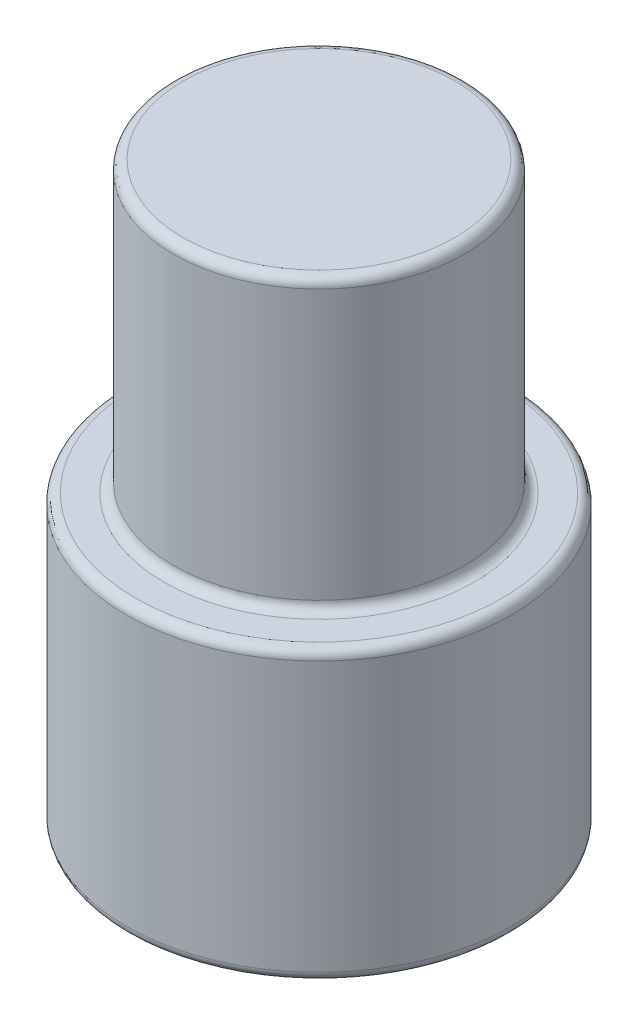
ISO-10303-21;
HEADER;
FILE_DESCRIPTION(('STEP AP214'),'2;1');
FILE_NAME('part.step','',(''),(''),'','','');
FILE_SCHEMA(('AUTOMOTIVE_DESIGN { 1 0 10303 214 1 1 1 1 }'));
ENDSEC;
DATA;
#1=APPLICATION_CONTEXT('core data for automotive mechanical design processes');
#2=APPLICATION_PROTOCOL_DEFINITION('international standard','automotive_design',2000,#1);
#3=PRODUCT_CONTEXT('',#1,'mechanical');
#4=PRODUCT('Part','Part','',(#3));
#5=PRODUCT_RELATED_PRODUCT_CATEGORY('part','',(#4));
#6=PRODUCT_DEFINITION_FORMATION('','',#4);
#7=PRODUCT_DEFINITION_CONTEXT('part definition',#1,'design');
#8=PRODUCT_DEFINITION('design','',#6,#7);
#9=PRODUCT_DEFINITION_SHAPE('','',#8);
#10=(LENGTH_UNIT() NAMED_UNIT(*) SI_UNIT(.MILLI.,.METRE.));
#11=(NAMED_UNIT(*) PLANE_ANGLE_UNIT() SI_UNIT($,.RADIAN.));
#12=(NAMED_UNIT(*) SI_UNIT($,.STERADIAN.) SOLID_ANGLE_UNIT());
#13=UNCERTAINTY_MEASURE_WITH_UNIT(LENGTH_MEASURE(1.E-05),#10,'distance_accuracy_value','');
#14=(GEOMETRIC_REPRESENTATION_CONTEXT(3) GLOBAL_UNCERTAINTY_ASSIGNED_CONTEXT((#13)) GLOBAL_UNIT_ASSIGNED_CONTEXT((#10,
#11,#12)) REPRESENTATION_CONTEXT('',''));
#15=CARTESIAN_POINT('',(0.,0.,0.));
#16=DIRECTION('',(0.,0.,1.));
#17=DIRECTION('',(1.,0.,0.));
#18=AXIS2_PLACEMENT_3D('',#15,#16,#17);
#19=CARTESIAN_POINT('',(0.,15.,0.));
#20=DIRECTION('',(0.,-1.,0.));
#21=DIRECTION('',(0.,0.,-1.));
#22=AXIS2_PLACEMENT_3D('',#19,#20,#21);
#23=CYLINDRICAL_SURFACE('',#22,10.);
#24=CARTESIAN_POINT('',(0.,0.5,0.));
#25=DIRECTION('',(0.,1.,0.));
#26=DIRECTION('',(0.,0.,1.));
#27=AXIS2_PLACEMENT_3D('',#24,#25,#26);
#28=CIRCLE('',#27,10.);
#29=CARTESIAN_POINT('',(0.,0.5,10.));
#30=VERTEX_POINT('',#29);
#31=EDGE_CURVE('E69',#30,#30,#28,.T.);
#32=ORIENTED_EDGE('',*,*,#31,.T.);
#33=EDGE_LOOP('',(#32));
#34=FACE_BOUND('',#33,.T.);
#35=CARTESIAN_POINT('',(0.,14.5,0.));
#36=DIRECTION('',(0.,1.,0.));
#37=DIRECTION('',(0.,0.,1.));
#38=AXIS2_PLACEMENT_3D('',#35,#36,#37);
#39=CIRCLE('',#38,10.);
#40=CARTESIAN_POINT('',(0.,14.5,10.));
#41=VERTEX_POINT('',#40);
#42=EDGE_CURVE('E73',#41,#41,#39,.F.);
#43=ORIENTED_EDGE('',*,*,#42,.T.);
#44=EDGE_LOOP('',(#43));
#45=FACE_BOUND('',#44,.T.);
#46=ADVANCED_FACE('F37',(#34,#45),#23,.T.);
#47=CARTESIAN_POINT('',(0.,15.,0.));
#48=DIRECTION('',(0.,1.,0.));
#49=DIRECTION('',(0.,0.,1.));
#50=AXIS2_PLACEMENT_3D('',#47,#48,#49);
#51=PLANE('',#50);
#52=CARTESIAN_POINT('',(0.,15.,0.));
#53=DIRECTION('',(0.,1.,0.));
#54=DIRECTION('',(0.,0.,1.));
#55=AXIS2_PLACEMENT_3D('',#52,#53,#54);
#56=CIRCLE('',#55,9.5);
#57=CARTESIAN_POINT('',(0.,15.,9.5));
#58=VERTEX_POINT('',#57);
#59=EDGE_CURVE('E55',#58,#58,#56,.T.);
#60=ORIENTED_EDGE('',*,*,#59,.T.);
#61=EDGE_LOOP('',(#60));
#62=FACE_BOUND('',#61,.T.);
#63=CARTESIAN_POINT('',(0.,15.,0.));
#64=DIRECTION('',(0.,1.,0.));
#65=DIRECTION('',(0.,0.,1.));
#66=AXIS2_PLACEMENT_3D('',#63,#64,#65);
#67=CIRCLE('',#66,8.05);
#68=CARTESIAN_POINT('',(0.,15.,8.05));
#69=VERTEX_POINT('',#68);
#70=EDGE_CURVE('E61',#69,#69,#67,.F.);
#71=ORIENTED_EDGE('',*,*,#70,.T.);
#72=EDGE_LOOP('',(#71));
#73=FACE_BOUND('',#72,.T.);
#74=ADVANCED_FACE('F87',(#62,#73),#51,.T.);
#75=CARTESIAN_POINT('',(0.,0.,0.));
#76=DIRECTION('',(0.,1.,0.));
#77=DIRECTION('',(0.,0.,1.));
#78=AXIS2_PLACEMENT_3D('',#75,#76,#77);
#79=PLANE('',#78);
#80=CARTESIAN_POINT('',(0.,0.,0.));
#81=DIRECTION('',(0.,1.,0.));
#82=DIRECTION('',(0.,0.,1.));
#83=AXIS2_PLACEMENT_3D('',#80,#81,#82);
#84=CIRCLE('',#83,9.5);
#85=CARTESIAN_POINT('',(0.,0.,9.5));
#86=VERTEX_POINT('',#85);
#87=EDGE_CURVE('E65',#86,#86,#84,.F.);
#88=ORIENTED_EDGE('',*,*,#87,.T.);
#89=EDGE_LOOP('',(#88));
#90=FACE_BOUND('',#89,.T.);
#91=ADVANCED_FACE('F90',(#90),#79,.F.);
#92=CARTESIAN_POINT('',(0.,30.,0.));
#93=DIRECTION('',(0.,-1.,0.));
#94=DIRECTION('',(0.,0.,-1.));
#95=AXIS2_PLACEMENT_3D('',#92,#93,#94);
#96=CYLINDRICAL_SURFACE('',#95,7.55);
#97=CARTESIAN_POINT('',(0.,15.5,0.));
#98=DIRECTION('',(0.,1.,0.));
#99=DIRECTION('',(0.,0.,1.));
#100=AXIS2_PLACEMENT_3D('',#97,#98,#99);
#101=CIRCLE('',#100,7.55);
#102=CARTESIAN_POINT('',(0.,15.5,7.55));
#103=VERTEX_POINT('',#102);
#104=EDGE_CURVE('E45',#103,#103,#101,.T.);
#105=ORIENTED_EDGE('',*,*,#104,.T.);
#106=EDGE_LOOP('',(#105));
#107=FACE_BOUND('',#106,.T.);
#108=CARTESIAN_POINT('',(0.,29.5,0.));
#109=DIRECTION('',(0.,1.,0.));
#110=DIRECTION('',(0.,0.,1.));
#111=AXIS2_PLACEMENT_3D('',#108,#109,#110);
#112=CIRCLE('',#111,7.55);
#113=CARTESIAN_POINT('',(0.,29.5,7.55));
#114=VERTEX_POINT('',#113);
#115=EDGE_CURVE('E50',#114,#114,#112,.F.);
#116=ORIENTED_EDGE('',*,*,#115,.T.);
#117=EDGE_LOOP('',(#116));
#118=FACE_BOUND('',#117,.T.);
#119=ADVANCED_FACE('F113',(#107,#118),#96,.T.);
#120=CARTESIAN_POINT('',(0.,30.,0.));
#121=DIRECTION('',(0.,1.,0.));
#122=DIRECTION('',(0.,0.,1.));
#123=AXIS2_PLACEMENT_3D('',#120,#121,#122);
#124=PLANE('',#123);
#125=CARTESIAN_POINT('',(0.,30.,0.));
#126=DIRECTION('',(0.,1.,0.));
#127=DIRECTION('',(0.,0.,1.));
#128=AXIS2_PLACEMENT_3D('',#125,#126,#127);
#129=CIRCLE('',#128,7.05);
#130=CARTESIAN_POINT('',(0.,30.,7.05));
#131=VERTEX_POINT('',#130);
#132=EDGE_CURVE('E10',#131,#131,#129,.T.);
#133=ORIENTED_EDGE('',*,*,#132,.T.);
#134=EDGE_LOOP('',(#133));
#135=FACE_BOUND('',#134,.T.);
#136=ADVANCED_FACE('F108',(#135),#124,.T.);
#137=CARTESIAN_POINT('',(0.,0.5,0.));
#138=DIRECTION('',(0.,1.,0.));
#139=DIRECTION('',(0.,0.,1.));
#140=AXIS2_PLACEMENT_3D('',#137,#138,#139);
#141=TOROIDAL_SURFACE('',#140,9.5,0.5);
#142=ORIENTED_EDGE('',*,*,#87,.F.);
#143=EDGE_LOOP('',(#142));
#144=FACE_BOUND('',#143,.T.);
#145=ORIENTED_EDGE('',*,*,#31,.F.);
#146=EDGE_LOOP('',(#145));
#147=FACE_BOUND('',#146,.T.);
#148=ADVANCED_FACE('F83',(#144,#147),#141,.T.);
#149=CARTESIAN_POINT('',(0.,14.5,0.));
#150=DIRECTION('',(0.,1.,0.));
#151=DIRECTION('',(0.,0.,1.));
#152=AXIS2_PLACEMENT_3D('',#149,#150,#151);
#153=TOROIDAL_SURFACE('',#152,9.5,0.5);
#154=ORIENTED_EDGE('',*,*,#42,.F.);
#155=EDGE_LOOP('',(#154));
#156=FACE_BOUND('',#155,.T.);
#157=ORIENTED_EDGE('',*,*,#59,.F.);
#158=EDGE_LOOP('',(#157));
#159=FACE_BOUND('',#158,.T.);
#160=ADVANCED_FACE('F79',(#156,#159),#153,.T.);
#161=CARTESIAN_POINT('',(0.,15.5,0.));
#162=DIRECTION('',(0.,1.,0.));
#163=DIRECTION('',(0.,0.,1.));
#164=AXIS2_PLACEMENT_3D('',#161,#162,#163);
#165=TOROIDAL_SURFACE('',#164,8.05,0.5);
#166=ORIENTED_EDGE('',*,*,#70,.F.);
#167=EDGE_LOOP('',(#166));
#168=FACE_BOUND('',#167,.T.);
#169=ORIENTED_EDGE('',*,*,#104,.F.);
#170=EDGE_LOOP('',(#169));
#171=FACE_BOUND('',#170,.T.);
#172=ADVANCED_FACE('F82',(#168,#171),#165,.F.);
#173=CARTESIAN_POINT('',(0.,29.5,0.));
#174=DIRECTION('',(0.,1.,0.));
#175=DIRECTION('',(0.,0.,1.));
#176=AXIS2_PLACEMENT_3D('',#173,#174,#175);
#177=TOROIDAL_SURFACE('',#176,7.05,0.5);
#178=ORIENTED_EDGE('',*,*,#115,.F.);
#179=EDGE_LOOP('',(#178));
#180=FACE_BOUND('',#179,.T.);
#181=ORIENTED_EDGE('',*,*,#132,.F.);
#182=EDGE_LOOP('',(#181));
#183=FACE_BOUND('',#182,.T.);
#184=ADVANCED_FACE('F39',(#180,#183),#177,.T.);
#185=CLOSED_SHELL('',(#46,#74,#91,#119,#136,#148,#160,#172,#184));
#186=MANIFOLD_SOLID_BREP('B2',#185);
#187=ADVANCED_BREP_SHAPE_REPRESENTATION('',(#18,#186),#14);
#188=SHAPE_DEFINITION_REPRESENTATION(#9,#187);
ENDSEC;
END-ISO-10303-21;
